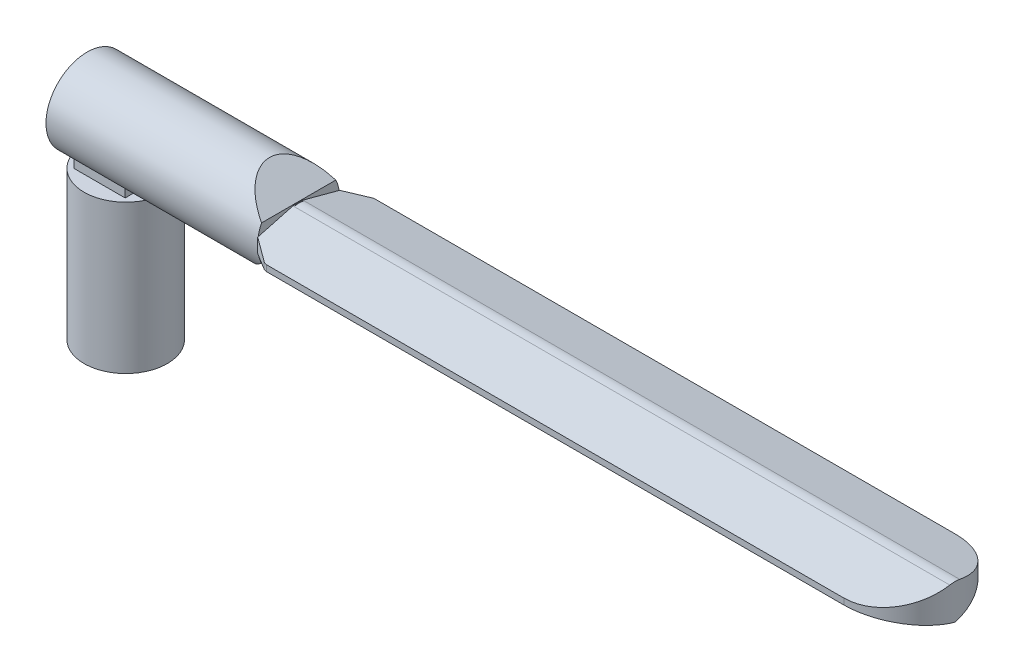
ISO-10303-21;
HEADER;
FILE_DESCRIPTION(('STEP AP214'),'2;1');
FILE_NAME('part.step','',(''),(''),'','','');
FILE_SCHEMA(('AUTOMOTIVE_DESIGN { 1 0 10303 214 1 1 1 1 }'));
ENDSEC;
DATA;
#1=APPLICATION_CONTEXT('core data for automotive mechanical design processes');
#2=APPLICATION_PROTOCOL_DEFINITION('international standard','automotive_design',2000,#1);
#3=PRODUCT_CONTEXT('',#1,'mechanical');
#4=PRODUCT('Part','Part','',(#3));
#5=PRODUCT_RELATED_PRODUCT_CATEGORY('part','',(#4));
#6=PRODUCT_DEFINITION_FORMATION('','',#4);
#7=PRODUCT_DEFINITION_CONTEXT('part definition',#1,'design');
#8=PRODUCT_DEFINITION('design','',#6,#7);
#9=PRODUCT_DEFINITION_SHAPE('','',#8);
#10=(LENGTH_UNIT() NAMED_UNIT(*) SI_UNIT(.MILLI.,.METRE.));
#11=(NAMED_UNIT(*) PLANE_ANGLE_UNIT() SI_UNIT($,.RADIAN.));
#12=(NAMED_UNIT(*) SI_UNIT($,.STERADIAN.) SOLID_ANGLE_UNIT());
#13=UNCERTAINTY_MEASURE_WITH_UNIT(LENGTH_MEASURE(1.E-05),#10,'distance_accuracy_value','');
#14=(GEOMETRIC_REPRESENTATION_CONTEXT(3) GLOBAL_UNCERTAINTY_ASSIGNED_CONTEXT((#13)) GLOBAL_UNIT_ASSIGNED_CONTEXT((#10,
#11,#12)) REPRESENTATION_CONTEXT('',''));
#15=CARTESIAN_POINT('',(0.,0.,0.));
#16=DIRECTION('',(0.,0.,1.));
#17=DIRECTION('',(1.,0.,0.));
#18=AXIS2_PLACEMENT_3D('',#15,#16,#17);
#19=CARTESIAN_POINT('',(-117.132239803963,2.8,8.56407466456359));
#20=DIRECTION('',(0.999999971842602,0.,0.000237307383945253));
#21=DIRECTION('',(0.000237307383945253,0.,-0.999999971842602));
#22=AXIS2_PLACEMENT_3D('',#19,#20,#21);
#23=CYLINDRICAL_SURFACE('',#22,6.42);
#24=CARTESIAN_POINT('',(-55.7280068959359,2.8,8.57864634284846));
#25=DIRECTION('',(0.627517438225577,-0.778602507524096,0.));
#26=DIRECTION('',(0.778602471360075,0.627517409079057,0.000304786302781807));
#27=AXIS2_PLACEMENT_3D('',#24,#25,#26);
#28=ELLIPSE('',#27,10.2307916715817,6.42);
#29=CARTESIAN_POINT('',(-59.1336186924822,0.0552351559265948,14.381515263114));
#30=VERTEX_POINT('',#29);
#31=CARTESIAN_POINT('',(-59.1308639326483,0.0574553643348558,2.77311222677423));
#32=VERTEX_POINT('',#31);
#33=EDGE_CURVE('E315',#30,#32,#28,.T.);
#34=ORIENTED_EDGE('',*,*,#33,.F.);
#35=CARTESIAN_POINT('',(-59.1322414370918,2.8,8.57783849283242));
#36=DIRECTION('',(-0.999999971842602,0.,-0.000237307383945253));
#37=DIRECTION('',(-0.000237307383945253,0.,0.999999971842602));
#38=AXIS2_PLACEMENT_3D('',#35,#36,#37);
#39=CIRCLE('',#38,6.42);
#40=CARTESIAN_POINT('',(-59.1337408927519,1.66359520688498,14.8964603281552));
#41=VERTEX_POINT('',#40);
#42=EDGE_CURVE('E510',#30,#41,#39,.T.);
#43=ORIENTED_EDGE('',*,*,#42,.T.);
#44=CARTESIAN_POINT('',(-59.1337602043918,2.29364272164236,14.9778384928324));
#45=VERTEX_POINT('',#44);
#46=EDGE_CURVE('E508',#41,#45,#39,.T.);
#47=ORIENTED_EDGE('',*,*,#46,.T.);
#48=CARTESIAN_POINT('',(-59.1337602043918,3.30635727835764,14.9778384928324));
#49=VERTEX_POINT('',#48);
#50=EDGE_CURVE('E325',#45,#49,#39,.T.);
#51=ORIENTED_EDGE('',*,*,#50,.T.);
#52=CARTESIAN_POINT('',(-59.1337408927519,3.93640479311502,14.8964603281552));
#53=VERTEX_POINT('',#52);
#54=EDGE_CURVE('E326',#49,#53,#39,.T.);
#55=ORIENTED_EDGE('',*,*,#54,.T.);
#56=CARTESIAN_POINT('',(-59.1336186924822,5.54476484407341,14.381515263114));
#57=VERTEX_POINT('',#56);
#58=EDGE_CURVE('E330',#53,#57,#39,.T.);
#59=ORIENTED_EDGE('',*,*,#58,.T.);
#60=CARTESIAN_POINT('',(-55.7280068959359,2.8,8.57864634284846));
#61=DIRECTION('',(0.627517438225577,0.778602507524095,0.));
#62=DIRECTION('',(0.778602471360075,-0.627517409079057,0.000304786302781807));
#63=AXIS2_PLACEMENT_3D('',#60,#61,#62);
#64=ELLIPSE('',#63,10.2307916715817,6.42);
#65=CARTESIAN_POINT('',(-59.1308639326483,5.54254463566515,2.77311222677423));
#66=VERTEX_POINT('',#65);
#67=EDGE_CURVE('E312',#66,#57,#64,.T.);
#68=ORIENTED_EDGE('',*,*,#67,.F.);
#69=CARTESIAN_POINT('',(-59.1307393914569,3.87395239703215,2.2483026494417));
#70=VERTEX_POINT('',#69);
#71=EDGE_CURVE('E331',#66,#70,#39,.T.);
#72=ORIENTED_EDGE('',*,*,#71,.T.);
#73=CARTESIAN_POINT('',(-59.1324678748693,3.87395228188942,2.24830221972318));
#74=CARTESIAN_POINT('',(-59.13214287009,3.87395230353957,2.24830230052267));
#75=CARTESIAN_POINT('',(-59.1318178653106,3.87395232518973,2.24830238132215));
#76=CARTESIAN_POINT('',(-59.1311678557519,3.87395236849005,2.24830254292113));
#77=CARTESIAN_POINT('',(-59.1308428509726,3.8739523901402,2.24830262372061));
#78=CARTESIAN_POINT('',(-59.1305178461932,3.87395241179036,2.2483027045201));
#79=B_SPLINE_CURVE_WITH_KNOTS('',3,(#73,#74,#75,#76,#77,#78),.UNSPECIFIED.,.F.,.F.,(4,2,4),(0.,
0.000975014370332675,0.00195002874066535),.UNSPECIFIED.);
#80=CARTESIAN_POINT('',(-59.1322414370918,3.87395229697354,2.24830227601791));
#81=VERTEX_POINT('',#80);
#82=EDGE_CURVE('E344',#81,#70,#79,.T.);
#83=ORIENTED_EDGE('',*,*,#82,.F.);
#84=CARTESIAN_POINT('',(-59.1322414370918,2.8,8.57783849283242));
#85=DIRECTION('',(-1.,0.,0.));
#86=DIRECTION('',(0.,0.,1.));
#87=AXIS2_PLACEMENT_3D('',#84,#85,#86);
#88=ELLIPSE('',#87,6.4200001807705,6.42);
#89=CARTESIAN_POINT('',(-59.1322414370918,3.24527621659354,2.17329858735413));
#90=VERTEX_POINT('',#89);
#91=EDGE_CURVE('E342',#90,#81,#88,.F.);
#92=ORIENTED_EDGE('',*,*,#91,.F.);
#93=CARTESIAN_POINT('',(-68.4825954280634,2.8,8.57561958472538));
#94=DIRECTION('',(0.564967003424933,0.,0.825113498278299));
#95=DIRECTION('',(0.825113498278299,0.,-0.564967003424933));
#96=AXIS2_PLACEMENT_3D('',#93,#94,#95);
#97=ELLIPSE('',#96,11.359558836909,6.42);
#98=CARTESIAN_POINT('',(-59.1307213454424,3.23003854493289,2.17225775887914));
#99=VERTEX_POINT('',#98);
#100=EDGE_CURVE('E345',#90,#99,#97,.F.);
#101=ORIENTED_EDGE('',*,*,#100,.T.);
#102=CARTESIAN_POINT('',(-59.1307213454424,2.36996145506712,2.17225775887914));
#103=VERTEX_POINT('',#102);
#104=EDGE_CURVE('E504',#99,#103,#39,.T.);
#105=ORIENTED_EDGE('',*,*,#104,.T.);
#106=CARTESIAN_POINT('',(-59.1322414370918,2.35472378340646,2.17329858735413));
#107=VERTEX_POINT('',#106);
#108=EDGE_CURVE('E341',#103,#107,#97,.F.);
#109=ORIENTED_EDGE('',*,*,#108,.T.);
#110=CARTESIAN_POINT('',(-59.1322414370918,1.72604770302646,2.24830227601791));
#111=VERTEX_POINT('',#110);
#112=EDGE_CURVE('E338',#111,#107,#88,.F.);
#113=ORIENTED_EDGE('',*,*,#112,.F.);
#114=CARTESIAN_POINT('',(-59.1305178461932,1.72604758820964,2.2483027045201));
#115=CARTESIAN_POINT('',(-59.1308428509726,1.7260476098598,2.24830262372061));
#116=CARTESIAN_POINT('',(-59.1311678557519,1.72604763150995,2.24830254292113));
#117=CARTESIAN_POINT('',(-59.1318178653106,1.72604767481027,2.24830238132215));
#118=CARTESIAN_POINT('',(-59.13214287009,1.72604769646043,2.24830230052267));
#119=CARTESIAN_POINT('',(-59.1324678748693,1.72604771811058,2.24830221972318));
#120=B_SPLINE_CURVE_WITH_KNOTS('',3,(#114,#115,#116,#117,#118,#119),.UNSPECIFIED.,.F.,.F.,(4,2,
4),(0.,0.000975014370332675,0.00195002874066535),.UNSPECIFIED.);
#121=CARTESIAN_POINT('',(-59.1307393914569,1.72604760296785,2.2483026494417));
#122=VERTEX_POINT('',#121);
#123=EDGE_CURVE('E372',#122,#111,#120,.T.);
#124=ORIENTED_EDGE('',*,*,#123,.F.);
#125=EDGE_CURVE('E511',#122,#32,#39,.T.);
#126=ORIENTED_EDGE('',*,*,#125,.T.);
#127=EDGE_LOOP('',(#34,#43,#47,#51,#55,#59,#68,#72,#83,#92,#101,#105,#109,#113,#124,#126));
#128=FACE_BOUND('',#127,.T.);
#129=DIRECTION('',(0.999999971842602,0.,0.000237307383945253));
#130=VECTOR('',#129,1.);
#131=CARTESIAN_POINT('',(-117.131946616476,-3.5,7.32859908243293));
#132=LINE('',#131,#130);
#133=CARTESIAN_POINT('',(-82.2112775705985,-3.5,7.33688601528316));
#134=VERTEX_POINT('',#133);
#135=CARTESIAN_POINT('',(-79.8051263130756,-3.5,7.33745701275954));
#136=VERTEX_POINT('',#135);
#137=EDGE_CURVE('E276',#134,#136,#132,.T.);
#138=ORIENTED_EDGE('',*,*,#137,.F.);
#139=CARTESIAN_POINT('',(-82.2112775705985,2.8,8.57236166698938));
#140=DIRECTION('',(-1.,0.,0.));
#141=DIRECTION('',(0.,0.,1.));
#142=AXIS2_PLACEMENT_3D('',#139,#140,#141);
#143=ELLIPSE('',#142,6.4200001807705,6.42);
#144=CARTESIAN_POINT('',(-82.2112775705985,-2.17942500643053,4.51998859308311));
#145=VERTEX_POINT('',#144);
#146=EDGE_CURVE('E286',#145,#134,#143,.T.);
#147=ORIENTED_EDGE('',*,*,#146,.F.);
#148=CARTESIAN_POINT('',(-17158.6835408057,2.8,4.51998859308311));
#149=DIRECTION('',(0.,0.,-1.));
#150=DIRECTION('',(1.,0.,0.));
#151=AXIS2_PLACEMENT_3D('',#148,#149,#150);
#152=ELLIPSE('',#151,27053.5197568109,6.42);
#153=CARTESIAN_POINT('',(-90.2112775705985,-2.18096941557892,4.51998859308311));
#154=VERTEX_POINT('',#153);
#155=EDGE_CURVE('E301',#145,#154,#152,.T.);
#156=ORIENTED_EDGE('',*,*,#155,.T.);
#157=CARTESIAN_POINT('',(-92.2112775705985,-2.1813553299984,4.51998859308311));
#158=VERTEX_POINT('',#157);
#159=EDGE_CURVE('E300',#154,#158,#152,.T.);
#160=ORIENTED_EDGE('',*,*,#159,.T.);
#161=CARTESIAN_POINT('',(-92.2112775705985,2.8,8.56998859308311));
#162=DIRECTION('',(1.,0.,0.));
#163=DIRECTION('',(0.,0.,1.));
#164=AXIS2_PLACEMENT_3D('',#161,#162,#163);
#165=ELLIPSE('',#164,6.4200001807705,6.42);
#166=CARTESIAN_POINT('',(-92.2112775705985,-2.1813553299984,12.6199885930831));
#167=VERTEX_POINT('',#166);
#168=EDGE_CURVE('E552',#158,#167,#165,.T.);
#169=ORIENTED_EDGE('',*,*,#168,.T.);
#170=CARTESIAN_POINT('',(16974.2609856645,2.8,12.6199885930831));
#171=DIRECTION('',(0.,0.,1.));
#172=DIRECTION('',(1.,0.,0.));
#173=AXIS2_PLACEMENT_3D('',#170,#171,#172);
#174=ELLIPSE('',#173,27053.5197568109,6.42);
#175=CARTESIAN_POINT('',(-90.2112775705985,-2.18174116930576,12.6199885930831));
#176=VERTEX_POINT('',#175);
#177=EDGE_CURVE('E297',#167,#176,#174,.T.);
#178=ORIENTED_EDGE('',*,*,#177,.T.);
#179=CARTESIAN_POINT('',(16974.2609856645,2.8,12.6199885930831));
#180=DIRECTION('',(0.,0.,-1.));
#181=DIRECTION('',(1.,0.,0.));
#182=AXIS2_PLACEMENT_3D('',#179,#180,#181);
#183=ELLIPSE('',#182,27053.5197568109,6.42);
#184=CARTESIAN_POINT('',(-82.2112775705985,-2.18328377576296,12.6199885930831));
#185=VERTEX_POINT('',#184);
#186=EDGE_CURVE('E283',#185,#176,#183,.T.);
#187=ORIENTED_EDGE('',*,*,#186,.F.);
#188=CARTESIAN_POINT('',(-82.2112775705985,2.8,8.57236166698938));
#189=DIRECTION('',(1.,0.,0.));
#190=DIRECTION('',(0.,0.,1.));
#191=AXIS2_PLACEMENT_3D('',#188,#189,#190);
#192=ELLIPSE('',#191,6.4200001807705,6.42);
#193=CARTESIAN_POINT('',(-82.2112775705985,-3.5,9.8078373186956));
#194=VERTEX_POINT('',#193);
#195=EDGE_CURVE('E56',#185,#194,#192,.T.);
#196=ORIENTED_EDGE('',*,*,#195,.T.);
#197=DIRECTION('',(0.999999971842602,0.,0.000237307383945253));
#198=VECTOR('',#197,1.);
#199=CARTESIAN_POINT('',(-117.132532991449,-3.5,9.79955024669426));
#200=LINE('',#199,#198);
#201=CARTESIAN_POINT('',(-79.8137043993653,-3.5,9.80840628052871));
#202=VERTEX_POINT('',#201);
#203=EDGE_CURVE('E66',#202,#194,#200,.F.);
#204=ORIENTED_EDGE('',*,*,#203,.F.);
#205=CARTESIAN_POINT('',(-79.8051263130756,-3.5,7.33745701275954));
#206=CARTESIAN_POINT('',(-79.7808758210322,-3.52502745063651,7.46495715602008));
#207=CARTESIAN_POINT('',(-79.7603517297202,-3.54627508851655,7.59392788161567));
#208=CARTESIAN_POINT('',(-79.7270160982325,-3.58095356912876,7.85395282916409));
#209=CARTESIAN_POINT('',(-79.714207724009,-3.59438120304222,7.98500788376156));
#210=CARTESIAN_POINT('',(-79.6967814143643,-3.61293098181828,8.24528329448746));
#211=CARTESIAN_POINT('',(-79.6919860755376,-3.61823280066718,8.37447879629126));
#212=CARTESIAN_POINT('',(-79.6901151149424,-3.62102020325441,8.63294048347601));
#213=CARTESIAN_POINT('',(-79.6930360532204,-3.6185092698668,8.7622066116833));
#214=CARTESIAN_POINT('',(-79.7078706289322,-3.60447032890725,9.04508359766209));
#215=CARTESIAN_POINT('',(-79.7214240721797,-3.59128223529515,9.1985352852453));
#216=CARTESIAN_POINT('',(-79.7498378416698,-3.56331770183063,9.42771932825835));
#217=CARTESIAN_POINT('',(-79.7607603092227,-3.55252908732739,9.50447397158576));
#218=CARTESIAN_POINT('',(-79.7852593497036,-3.52826332123425,9.65712089561353));
#219=CARTESIAN_POINT('',(-79.7988356065545,-3.51478648981827,9.73301327787483));
#220=CARTESIAN_POINT('',(-79.8137043993653,-3.50000000000001,9.80840628052871));
#221=B_SPLINE_CURVE_WITH_KNOTS('',3,(#205,#206,#207,#208,#209,#210,#211,#212,#213,#214,#215,
#216,#217,#218,#219,#220),.UNSPECIFIED.,.F.,.F.,(4,2,2,2,2,2,2,4),(0.,0.396446534136642,
0.793055629618339,1.18076170985585,1.56829497801496,2.03126392781121,2.26600766161225,
2.50072345347582),.UNSPECIFIED.);
#222=EDGE_CURVE('E11',#136,#202,#221,.T.);
#223=ORIENTED_EDGE('',*,*,#222,.F.);
#224=EDGE_LOOP('',(#138,#147,#156,#160,#169,#178,#187,#196,#204,#223));
#225=FACE_BOUND('',#224,.T.);
#226=ADVANCED_FACE('F41',(#128,#225),#23,.T.);
#227=CARTESIAN_POINT('',(-92.2112775705985,-16.,4.51998859308311));
#228=DIRECTION('',(0.,0.,-1.));
#229=DIRECTION('',(-1.,0.,0.));
#230=AXIS2_PLACEMENT_3D('',#227,#228,#229);
#231=PLANE('',#230);
#232=DIRECTION('',(0.,1.,0.));
#233=VECTOR('',#232,1.);
#234=CARTESIAN_POINT('',(-90.2112775705985,-3.5,4.51998859308311));
#235=LINE('',#234,#233);
#236=CARTESIAN_POINT('',(-90.2112775705985,0.,4.51998859308311));
#237=VERTEX_POINT('',#236);
#238=EDGE_CURVE('E262',#154,#237,#235,.T.);
#239=ORIENTED_EDGE('',*,*,#238,.T.);
#240=DIRECTION('',(-1.,0.,0.));
#241=VECTOR('',#240,1.);
#242=CARTESIAN_POINT('',(-92.2112775705985,0.,4.51998859308311));
#243=LINE('',#242,#241);
#244=CARTESIAN_POINT('',(-92.2112775705985,0.,4.51998859308311));
#245=VERTEX_POINT('',#244);
#246=EDGE_CURVE('E292',#237,#245,#243,.T.);
#247=ORIENTED_EDGE('',*,*,#246,.T.);
#248=DIRECTION('',(0.,1.,0.));
#249=VECTOR('',#248,1.);
#250=CARTESIAN_POINT('',(-92.2112775705985,-3.62,4.51998859308311));
#251=LINE('',#250,#249);
#252=EDGE_CURVE('E563',#158,#245,#251,.T.);
#253=ORIENTED_EDGE('',*,*,#252,.F.);
#254=ORIENTED_EDGE('',*,*,#159,.F.);
#255=EDGE_LOOP('',(#239,#247,#253,#254));
#256=FACE_BOUND('',#255,.T.);
#257=ADVANCED_FACE('F363',(#256),#231,.F.);
#258=CARTESIAN_POINT('',(-92.2112775705985,-16.,12.6199885930831));
#259=DIRECTION('',(0.,0.,1.));
#260=DIRECTION('',(1.,0.,0.));
#261=AXIS2_PLACEMENT_3D('',#258,#259,#260);
#262=PLANE('',#261);
#263=DIRECTION('',(0.,1.,0.));
#264=VECTOR('',#263,1.);
#265=CARTESIAN_POINT('',(-90.2112775705985,-3.5,12.6199885930831));
#266=LINE('',#265,#264);
#267=CARTESIAN_POINT('',(-90.2112775705985,0.,12.6199885930831));
#268=VERTEX_POINT('',#267);
#269=EDGE_CURVE('E263',#176,#268,#266,.T.);
#270=ORIENTED_EDGE('',*,*,#269,.F.);
#271=ORIENTED_EDGE('',*,*,#177,.F.);
#272=DIRECTION('',(0.,-1.,0.));
#273=VECTOR('',#272,1.);
#274=CARTESIAN_POINT('',(-92.2112775705985,-3.62,12.6199885930831));
#275=LINE('',#274,#273);
#276=CARTESIAN_POINT('',(-92.2112775705985,0.,12.6199885930831));
#277=VERTEX_POINT('',#276);
#278=EDGE_CURVE('E560',#277,#167,#275,.T.);
#279=ORIENTED_EDGE('',*,*,#278,.F.);
#280=DIRECTION('',(1.,0.,0.));
#281=VECTOR('',#280,1.);
#282=CARTESIAN_POINT('',(-92.2112775705985,0.,12.6199885930831));
#283=LINE('',#282,#281);
#284=EDGE_CURVE('E289',#277,#268,#283,.T.);
#285=ORIENTED_EDGE('',*,*,#284,.T.);
#286=EDGE_LOOP('',(#270,#271,#279,#285));
#287=FACE_BOUND('',#286,.T.);
#288=ADVANCED_FACE('F589',(#287),#262,.F.);
#289=CARTESIAN_POINT('',(0.,0.,0.));
#290=DIRECTION('',(0.,1.,0.));
#291=DIRECTION('',(0.,0.,1.));
#292=AXIS2_PLACEMENT_3D('',#289,#290,#291);
#293=PLANE('',#292);
#294=DIRECTION('',(0.,0.,-1.));
#295=VECTOR('',#294,1.);
#296=CARTESIAN_POINT('',(-90.2112775705985,0.,4.51998859308311));
#297=LINE('',#296,#295);
#298=EDGE_CURVE('E273',#268,#237,#297,.T.);
#299=ORIENTED_EDGE('',*,*,#298,.F.);
#300=ORIENTED_EDGE('',*,*,#284,.F.);
#301=DIRECTION('',(0.,0.,1.));
#302=VECTOR('',#301,1.);
#303=CARTESIAN_POINT('',(-92.2112775705985,0.,8.56998859308311));
#304=LINE('',#303,#302);
#305=EDGE_CURVE('E294',#245,#277,#304,.T.);
#306=ORIENTED_EDGE('',*,*,#305,.F.);
#307=ORIENTED_EDGE('',*,*,#246,.F.);
#308=EDGE_LOOP('',(#299,#300,#306,#307));
#309=FACE_BOUND('',#308,.T.);
#310=ADVANCED_FACE('F389',(#309),#293,.F.);
#311=CARTESIAN_POINT('',(34.8662397956082,0.,8.69000000000002));
#312=DIRECTION('',(0.,0.965925826289066,0.258819045102528));
#313=DIRECTION('',(1.,0.,0.));
#314=AXIS2_PLACEMENT_3D('',#311,#312,#313);
#315=PLANE('',#314);
#316=DIRECTION('',(1.,0.,0.));
#317=VECTOR('',#316,1.);
#318=CARTESIAN_POINT('',(34.8662397956082,0.000289587050011607,8.68891924641616));
#319=LINE('',#318,#317);
#320=CARTESIAN_POINT('',(-58.9436505515468,0.000289587050009449,8.68891924641616));
#321=VERTEX_POINT('',#320);
#322=CARTESIAN_POINT('',(43.5551590420244,0.000289587050012603,8.68891924641616));
#323=VERTEX_POINT('',#322);
#324=EDGE_CURVE('E435',#321,#323,#319,.T.);
#325=ORIENTED_EDGE('',*,*,#324,.F.);
#326=DIRECTION('',(0.,-0.258819045102528,0.965925826289066));
#327=VECTOR('',#326,1.);
#328=CARTESIAN_POINT('',(-58.9436505515468,0.,8.69000000000002));
#329=LINE('',#328,#327);
#330=CARTESIAN_POINT('',(-58.9436505515468,0.208340649413047,7.91246211110868));
#331=VERTEX_POINT('',#330);
#332=EDGE_CURVE('E322',#321,#331,#329,.F.);
#333=ORIENTED_EDGE('',*,*,#332,.T.);
#334=DIRECTION('',(0.305754930362129,0.246424264976754,-0.919667877111034));
#335=VECTOR('',#334,1.);
#336=CARTESIAN_POINT('',(-50.4080675965343,7.08762384967373,-17.7613723119185));
#337=LINE('',#336,#335);
#338=CARTESIAN_POINT('',(-59.1322181355043,0.0563639397648368,8.47964691308289));
#339=VERTEX_POINT('',#338);
#340=EDGE_CURVE('E317',#331,#339,#337,.F.);
#341=ORIENTED_EDGE('',*,*,#340,.T.);
#342=DIRECTION('',(0.00022922133135417,0.258819038303038,-0.965925800913027));
#343=VECTOR('',#342,1.);
#344=CARTESIAN_POINT('',(-59.1333280189343,-1.19683077944475,13.15663327695));
#345=LINE('',#344,#343);
#346=EDGE_CURVE('E421',#122,#339,#345,.F.);
#347=ORIENTED_EDGE('',*,*,#346,.F.);
#348=ORIENTED_EDGE('',*,*,#123,.T.);
#349=DIRECTION('',(0.,0.258819045102528,-0.965925826289066));
#350=VECTOR('',#349,1.);
#351=CARTESIAN_POINT('',(-59.1322414370918,0.403169246195493,7.18535188914924));
#352=LINE('',#351,#350);
#353=CARTESIAN_POINT('',(-59.1322414370918,1.74614488083327,2.17329858735413));
#354=VERTEX_POINT('',#353);
#355=EDGE_CURVE('E424',#354,#111,#352,.F.);
#356=ORIENTED_EDGE('',*,*,#355,.F.);
#357=DIRECTION('',(0.815818536320453,0.149677118278064,-0.558602610144214));
#358=VECTOR('',#357,1.);
#359=CARTESIAN_POINT('',(0.246375695347363,12.6402590790781,-38.4840891039518));
#360=LINE('',#359,#358);
#361=CARTESIAN_POINT('',(-55.958218902423,2.32847848222653,0.));
#362=VERTEX_POINT('',#361);
#363=EDGE_CURVE('E427',#362,#354,#360,.F.);
#364=ORIENTED_EDGE('',*,*,#363,.F.);
#365=DIRECTION('',(-1.,0.,0.));
#366=VECTOR('',#365,1.);
#367=CARTESIAN_POINT('',(-55.958218902423,2.32847848222653,0.));
#368=LINE('',#367,#366);
#369=CARTESIAN_POINT('',(34.8662397956082,2.32847848222653,0.));
#370=VERTEX_POINT('',#369);
#371=EDGE_CURVE('E430',#370,#362,#368,.T.);
#372=ORIENTED_EDGE('',*,*,#371,.F.);
#373=CARTESIAN_POINT('',(34.8662397956082,0.000289587049998562,8.68891924641621));
#374=DIRECTION('',(0.,0.965925826289066,0.258819045102528));
#375=DIRECTION('',(0.,-0.258819045102528,0.965925826289066));
#376=AXIS2_PLACEMENT_3D('',#373,#374,#375);
#377=ELLIPSE('',#376,8.99543112932145,8.68891924641621);
#378=EDGE_CURVE('E433',#323,#370,#377,.T.);
#379=ORIENTED_EDGE('',*,*,#378,.F.);
#380=EDGE_LOOP('',(#325,#333,#341,#347,#348,#356,#364,#372,#379));
#381=FACE_BOUND('',#380,.T.);
#382=ADVANCED_FACE('F385',(#381),#315,.F.);
#383=CARTESIAN_POINT('',(34.8662397956082,0.,8.6878384928323));
#384=DIRECTION('',(0.,0.965925826289069,-0.258819045102518));
#385=DIRECTION('',(-1.,0.,0.));
#386=AXIS2_PLACEMENT_3D('',#383,#384,#385);
#387=PLANE('',#386);
#388=DIRECTION('',(-0.305754930362118,-0.246424264976745,-0.91966787711104));
#389=VECTOR('',#388,1.);
#390=CARTESIAN_POINT('',(-50.4080675965349,7.08762384967324,35.1392108047501));
#391=LINE('',#390,#389);
#392=CARTESIAN_POINT('',(-59.1323173884015,0.0562839465420773,8.89789304097782));
#393=VERTEX_POINT('',#392);
#394=CARTESIAN_POINT('',(-58.9436505515468,0.208340649413051,9.46537638172371));
#395=VERTEX_POINT('',#394);
#396=EDGE_CURVE('E314',#393,#395,#391,.F.);
#397=ORIENTED_EDGE('',*,*,#396,.T.);
#398=DIRECTION('',(0.,0.258819045102518,0.965925826289069));
#399=VECTOR('',#398,1.);
#400=CARTESIAN_POINT('',(-58.9436505515468,0.,8.6878384928323));
#401=LINE('',#400,#399);
#402=EDGE_CURVE('E548',#395,#321,#401,.F.);
#403=ORIENTED_EDGE('',*,*,#402,.T.);
#404=ORIENTED_EDGE('',*,*,#324,.T.);
#405=CARTESIAN_POINT('',(34.8662397956082,0.000289587050024583,8.68891924641621));
#406=DIRECTION('',(0.,0.965925826289069,-0.258819045102518));
#407=DIRECTION('',(0.,-0.258819045102518,-0.965925826289069));
#408=AXIS2_PLACEMENT_3D('',#405,#406,#407);
#409=ELLIPSE('',#408,8.99543112932142,8.68891924641621);
#410=CARTESIAN_POINT('',(34.8662397956082,2.32847848222646,17.3778384928324));
#411=VERTEX_POINT('',#410);
#412=EDGE_CURVE('E450',#411,#323,#409,.T.);
#413=ORIENTED_EDGE('',*,*,#412,.F.);
#414=DIRECTION('',(1.,0.,0.));
#415=VECTOR('',#414,1.);
#416=CARTESIAN_POINT('',(34.8662397956082,2.32847848222646,17.3778384928324));
#417=LINE('',#416,#415);
#418=CARTESIAN_POINT('',(-55.3238356065649,2.32847848222646,17.3778384928324));
#419=VERTEX_POINT('',#418);
#420=EDGE_CURVE('E453',#419,#411,#417,.T.);
#421=ORIENTED_EDGE('',*,*,#420,.F.);
#422=CARTESIAN_POINT('',(-55.3238356065649,2.06052928979534,16.3778384928324));
#423=DIRECTION('',(0.,0.965925826289069,-0.258819045102518));
#424=DIRECTION('',(0.,-0.258819045102518,-0.965925826289069));
#425=AXIS2_PLACEMENT_3D('',#422,#423,#424);
#426=ELLIPSE('',#425,1.03527618041008,1.);
#427=CARTESIAN_POINT('',(-55.8893639621164,2.28151471962211,17.2025673446784));
#428=VERTEX_POINT('',#427);
#429=EDGE_CURVE('E415',#419,#428,#426,.F.);
#430=ORIENTED_EDGE('',*,*,#429,.T.);
#431=DIRECTION('',(-0.815420062977005,-0.149822501051534,-0.559145186041372));
#432=VECTOR('',#431,1.);
#433=CARTESIAN_POINT('',(-55.2340840696887,2.40191361195973,17.6519021280574));
#434=LINE('',#433,#432);
#435=CARTESIAN_POINT('',(-59.1337602043918,1.68540042039177,14.9778384928324));
#436=VERTEX_POINT('',#435);
#437=EDGE_CURVE('E455',#436,#428,#434,.F.);
#438=ORIENTED_EDGE('',*,*,#437,.F.);
#439=DIRECTION('',(0.00022922133135417,-0.258819038303028,-0.965925800913029));
#440=VECTOR('',#439,1.);
#441=CARTESIAN_POINT('',(-59.1339924452325,1.94762885562546,15.9564883363138));
#442=LINE('',#441,#440);
#443=EDGE_CURVE('E460',#41,#436,#442,.F.);
#444=ORIENTED_EDGE('',*,*,#443,.F.);
#445=EDGE_CURVE('E457',#393,#41,#442,.F.);
#446=ORIENTED_EDGE('',*,*,#445,.F.);
#447=EDGE_LOOP('',(#397,#403,#404,#413,#421,#430,#438,#444,#446));
#448=FACE_BOUND('',#447,.T.);
#449=ADVANCED_FACE('F388',(#448),#387,.F.);
#450=CARTESIAN_POINT('',(-59.1322414370918,2.8,8.57783849283242));
#451=DIRECTION('',(-0.999999971842602,0.,-0.000237307383945253));
#452=DIRECTION('',(-0.000237307383945253,0.,0.999999971842602));
#453=AXIS2_PLACEMENT_3D('',#450,#451,#452);
#454=PLANE('',#453);
#455=DIRECTION('',(0.000237307379604913,-0.000191258719927884,-0.999999953552654));
#456=VECTOR('',#455,1.);
#457=CARTESIAN_POINT('',(-59.1322413125653,5.54365473986928,8.57731374494412));
#458=LINE('',#457,#456);
#459=EDGE_CURVE('E308',#57,#66,#458,.T.);
#460=ORIENTED_EDGE('',*,*,#459,.F.);
#461=ORIENTED_EDGE('',*,*,#58,.F.);
#462=DIRECTION('',(-0.00022922133135417,-0.258819038303028,0.965925800913029));
#463=VECTOR('',#462,1.);
#464=CARTESIAN_POINT('',(-59.1343248031121,3.27709827494915,17.3570257517116));
#465=LINE('',#464,#463);
#466=CARTESIAN_POINT('',(-59.1324520563923,5.39165935058695,9.46537638172373));
#467=VERTEX_POINT('',#466);
#468=EDGE_CURVE('E329',#467,#53,#465,.T.);
#469=ORIENTED_EDGE('',*,*,#468,.F.);
#470=CARTESIAN_POINT('',(-59.1322677973756,2.49388187171974,8.68891924641618));
#471=DIRECTION('',(-0.999999971842602,0.,-0.000237307383945253));
#472=DIRECTION('',(-0.000237307383945253,0.,0.999999971842602));
#473=AXIS2_PLACEMENT_3D('',#470,#471,#472);
#474=ELLIPSE('',#473,3.0000000844722,3.);
#475=CARTESIAN_POINT('',(-59.1320835383589,5.39165935058694,7.9124621111086));
#476=VERTEX_POINT('',#475);
#477=EDGE_CURVE('E628',#467,#476,#474,.T.);
#478=ORIENTED_EDGE('',*,*,#477,.T.);
#479=DIRECTION('',(0.00022922133135417,-0.258819038303038,-0.965925800913027));
#480=VECTOR('',#479,1.);
#481=CARTESIAN_POINT('',(-59.1336602492637,7.17195962913816,14.5566332033906));
#482=LINE('',#481,#480);
#483=EDGE_CURVE('E441',#476,#70,#482,.T.);
#484=ORIENTED_EDGE('',*,*,#483,.T.);
#485=ORIENTED_EDGE('',*,*,#71,.F.);
#486=EDGE_LOOP('',(#460,#461,#469,#478,#484,#485));
#487=FACE_BOUND('',#486,.T.);
#488=ADVANCED_FACE('F365',(#487),#454,.F.);
#489=DIRECTION('',(-0.000237307379604913,-0.000191258719927884,0.999999953552654));
#490=VECTOR('',#489,1.);
#491=CARTESIAN_POINT('',(-59.1322413125653,0.0563452601307249,8.57731374494412));
#492=LINE('',#491,#490);
#493=EDGE_CURVE('E546',#32,#339,#492,.T.);
#494=ORIENTED_EDGE('',*,*,#493,.F.);
#495=ORIENTED_EDGE('',*,*,#125,.F.);
#496=ORIENTED_EDGE('',*,*,#346,.T.);
#497=EDGE_LOOP('',(#494,#495,#496));
#498=FACE_BOUND('',#497,.T.);
#499=ADVANCED_FACE('F545',(#498),#454,.F.);
#500=EDGE_CURVE('E549',#393,#30,#492,.T.);
#501=ORIENTED_EDGE('',*,*,#500,.F.);
#502=ORIENTED_EDGE('',*,*,#445,.T.);
#503=ORIENTED_EDGE('',*,*,#42,.F.);
#504=EDGE_LOOP('',(#501,#502,#503));
#505=FACE_BOUND('',#504,.T.);
#506=ADVANCED_FACE('F402',(#505),#454,.F.);
#507=CARTESIAN_POINT('',(34.8662397956082,2.49388187171974,8.68891924641617));
#508=DIRECTION('',(-1.,0.,0.));
#509=DIRECTION('',(0.,0.,1.));
#510=AXIS2_PLACEMENT_3D('',#507,#508,#509);
#511=CYLINDRICAL_SURFACE('',#510,3.);
#512=DIRECTION('',(-1.,0.,0.));
#513=VECTOR('',#512,1.);
#514=CARTESIAN_POINT('',(34.8662397956082,5.39165935058695,9.46537638172373));
#515=LINE('',#514,#513);
#516=CARTESIAN_POINT('',(-58.9436505515468,5.39165935058695,9.46537638172373));
#517=VERTEX_POINT('',#516);
#518=EDGE_CURVE('E380',#517,#467,#515,.T.);
#519=ORIENTED_EDGE('',*,*,#518,.F.);
#520=CARTESIAN_POINT('',(-55.3481858300042,2.49388187171974,8.68891924641618));
#521=DIRECTION('',(0.627517438225577,0.778602507524095,0.));
#522=DIRECTION('',(-0.778602507524095,0.627517438225577,0.));
#523=AXIS2_PLACEMENT_3D('',#520,#521,#522);
#524=ELLIPSE('',#523,4.78074363715383,3.);
#525=CARTESIAN_POINT('',(-58.9436505515468,5.39165935058695,7.91246211110863));
#526=VERTEX_POINT('',#525);
#527=EDGE_CURVE('E554',#517,#526,#524,.F.);
#528=ORIENTED_EDGE('',*,*,#527,.T.);
#529=DIRECTION('',(-1.,0.,0.));
#530=VECTOR('',#529,1.);
#531=CARTESIAN_POINT('',(-55.958218902423,5.39165935058694,7.9124621111086));
#532=LINE('',#531,#530);
#533=EDGE_CURVE('E631',#476,#526,#532,.F.);
#534=ORIENTED_EDGE('',*,*,#533,.F.);
#535=ORIENTED_EDGE('',*,*,#477,.F.);
#536=EDGE_LOOP('',(#519,#528,#534,#535));
#537=FACE_BOUND('',#536,.T.);
#538=ADVANCED_FACE('F43',(#537),#511,.T.);
#539=CARTESIAN_POINT('',(43.5203967151337,5.39165935058694,7.91246211110859));
#540=VERTEX_POINT('',#539);
#541=EDGE_CURVE('E637',#526,#540,#532,.F.);
#542=ORIENTED_EDGE('',*,*,#541,.F.);
#543=CARTESIAN_POINT('',(-58.9436505515468,2.49388187171974,8.68891924641618));
#544=DIRECTION('',(-1.,0.,0.));
#545=DIRECTION('',(0.,0.,1.));
#546=AXIS2_PLACEMENT_3D('',#543,#544,#545);
#547=CIRCLE('',#546,3.);
#548=EDGE_CURVE('E677',#526,#517,#547,.F.);
#549=ORIENTED_EDGE('',*,*,#548,.T.);
#550=CARTESIAN_POINT('',(43.5203967151337,5.39165935058695,9.46537638172373));
#551=VERTEX_POINT('',#550);
#552=EDGE_CURVE('E383',#551,#517,#515,.T.);
#553=ORIENTED_EDGE('',*,*,#552,.F.);
#554=CARTESIAN_POINT('',(43.5203967151337,5.39165935058694,7.91246211110859));
#555=CARTESIAN_POINT('',(43.5274161954196,5.41260344746621,7.99058563525631));
#556=CARTESIAN_POINT('',(43.5334336082892,5.4303914599033,8.06964927788868));
#557=CARTESIAN_POINT('',(43.5433491024557,5.45953968504035,8.22910629146036));
#558=CARTESIAN_POINT('',(43.5472465807495,5.47089806890734,8.30950003404535));
#559=CARTESIAN_POINT('',(43.5527396517106,5.48687543773905,8.46918347624755));
#560=CARTESIAN_POINT('',(43.5543856182854,5.49164193330061,8.54845665615965));
#561=CARTESIAN_POINT('',(43.5555023257781,5.49487587917558,8.70711320610669));
#562=CARTESIAN_POINT('',(43.5549738674154,5.49334564822244,8.78649652482056));
#563=CARTESIAN_POINT('',(43.5513109575309,5.48272745658037,8.96631680907991));
#564=CARTESIAN_POINT('',(43.5475093013821,5.47170433909288,9.06663130175489));
#565=CARTESIAN_POINT('',(43.5365074108368,5.4394509606525,9.26694570528913));
#566=CARTESIAN_POINT('',(43.5292577383407,5.41807213310539,9.36691901556857));
#567=CARTESIAN_POINT('',(43.5203967151337,5.39165935058695,9.46537638172373));
#568=B_SPLINE_CURVE_WITH_KNOTS('',3,(#554,#555,#556,#557,#558,#559,#560,#561,#562,#563,#564,
#565,#566,#567),.UNSPECIFIED.,.F.,.F.,(4,2,2,2,2,2,4),(0.,0.243492877537123,0.487054979031359,
0.725073383174689,0.963004146249747,1.26539270741895,1.5722540294871),.UNSPECIFIED.);
#569=EDGE_CURVE('E636',#540,#551,#568,.T.);
#570=ORIENTED_EDGE('',*,*,#569,.F.);
#571=EDGE_LOOP('',(#542,#549,#553,#570));
#572=FACE_BOUND('',#571,.T.);
#573=ADVANCED_FACE('F676',(#572),#511,.T.);
#574=CARTESIAN_POINT('',(-59.1337602043918,5.6,14.9778384928324));
#575=DIRECTION('',(-0.999999971842602,0.,-0.000237307383945253));
#576=DIRECTION('',(-0.000237307383945253,0.,0.999999971842602));
#577=AXIS2_PLACEMENT_3D('',#574,#575,#576);
#578=PLANE('',#577);
#579=DIRECTION('',(0.,-1.,0.));
#580=VECTOR('',#579,1.);
#581=CARTESIAN_POINT('',(-59.1337602043918,5.6,14.9778384928324));
#582=LINE('',#581,#580);
#583=EDGE_CURVE('E481',#45,#436,#582,.T.);
#584=ORIENTED_EDGE('',*,*,#583,.F.);
#585=ORIENTED_EDGE('',*,*,#46,.F.);
#586=ORIENTED_EDGE('',*,*,#443,.T.);
#587=EDGE_LOOP('',(#584,#585,#586));
#588=FACE_BOUND('',#587,.T.);
#589=ADVANCED_FACE('F654',(#588),#578,.T.);
#590=CARTESIAN_POINT('',(-55.958218902423,5.6,0.));
#591=DIRECTION('',(0.564967003424933,0.,0.825113498278299));
#592=DIRECTION('',(0.825113498278299,0.,-0.564967003424933));
#593=AXIS2_PLACEMENT_3D('',#590,#591,#592);
#594=PLANE('',#593);
#595=ORIENTED_EDGE('',*,*,#108,.F.);
#596=DIRECTION('',(0.,-1.,0.));
#597=VECTOR('',#596,1.);
#598=CARTESIAN_POINT('',(-59.1307213454424,5.6,2.17225775887914));
#599=LINE('',#598,#597);
#600=EDGE_CURVE('E333',#99,#103,#599,.T.);
#601=ORIENTED_EDGE('',*,*,#600,.F.);
#602=ORIENTED_EDGE('',*,*,#100,.F.);
#603=DIRECTION('',(0.,-1.,0.));
#604=VECTOR('',#603,1.);
#605=CARTESIAN_POINT('',(-59.1322414370918,5.6,2.17329858735413));
#606=LINE('',#605,#604);
#607=CARTESIAN_POINT('',(-59.1322414370918,3.85385511916673,2.17329858735413));
#608=VERTEX_POINT('',#607);
#609=EDGE_CURVE('E470',#608,#90,#606,.T.);
#610=ORIENTED_EDGE('',*,*,#609,.F.);
#611=DIRECTION('',(0.815818536320453,-0.149677118278064,-0.558602610144214));
#612=VECTOR('',#611,1.);
#613=CARTESIAN_POINT('',(-55.958218902423,3.27152151777347,0.));
#614=LINE('',#613,#612);
#615=CARTESIAN_POINT('',(-55.958218902423,3.27152151777347,0.));
#616=VERTEX_POINT('',#615);
#617=EDGE_CURVE('E437',#608,#616,#614,.T.);
#618=ORIENTED_EDGE('',*,*,#617,.T.);
#619=DIRECTION('',(0.,-1.,0.));
#620=VECTOR('',#619,1.);
#621=CARTESIAN_POINT('',(-55.958218902423,5.6,0.));
#622=LINE('',#621,#620);
#623=EDGE_CURVE('E473',#616,#362,#622,.T.);
#624=ORIENTED_EDGE('',*,*,#623,.T.);
#625=ORIENTED_EDGE('',*,*,#363,.T.);
#626=EDGE_CURVE('E474',#107,#354,#606,.T.);
#627=ORIENTED_EDGE('',*,*,#626,.F.);
#628=EDGE_LOOP('',(#595,#601,#602,#610,#618,#624,#625,#627));
#629=FACE_BOUND('',#628,.T.);
#630=ADVANCED_FACE('F521',(#629),#594,.F.);
#631=CARTESIAN_POINT('',(-59.1322414370918,5.6,8.57783849283242));
#632=DIRECTION('',(-1.,0.,0.));
#633=DIRECTION('',(0.,0.,1.));
#634=AXIS2_PLACEMENT_3D('',#631,#632,#633);
#635=PLANE('',#634);
#636=ORIENTED_EDGE('',*,*,#355,.T.);
#637=ORIENTED_EDGE('',*,*,#112,.T.);
#638=ORIENTED_EDGE('',*,*,#626,.T.);
#639=EDGE_LOOP('',(#636,#637,#638));
#640=FACE_BOUND('',#639,.T.);
#641=ADVANCED_FACE('F540',(#640),#635,.T.);
#642=ORIENTED_EDGE('',*,*,#609,.T.);
#643=ORIENTED_EDGE('',*,*,#91,.T.);
#644=DIRECTION('',(0.,-0.258819045102528,-0.965925826289066));
#645=VECTOR('',#644,1.);
#646=CARTESIAN_POINT('',(-59.1322414370918,5.5719596232081,8.58535188914927));
#647=LINE('',#646,#645);
#648=EDGE_CURVE('E439',#81,#608,#647,.T.);
#649=ORIENTED_EDGE('',*,*,#648,.T.);
#650=EDGE_LOOP('',(#642,#643,#649));
#651=FACE_BOUND('',#650,.T.);
#652=ADVANCED_FACE('F527',(#651),#635,.T.);
#653=CARTESIAN_POINT('',(-55.958218902423,3.27152151777347,0.));
#654=DIRECTION('',(0.,0.965925826289066,-0.258819045102528));
#655=DIRECTION('',(-1.,0.,0.));
#656=AXIS2_PLACEMENT_3D('',#653,#654,#655);
#657=PLANE('',#656);
#658=ORIENTED_EDGE('',*,*,#483,.F.);
#659=ORIENTED_EDGE('',*,*,#533,.T.);
#660=ORIENTED_EDGE('',*,*,#541,.T.);
#661=CARTESIAN_POINT('',(34.8662397956082,5.59971041295,8.68891924641621));
#662=DIRECTION('',(0.,0.965925826289066,-0.258819045102528));
#663=DIRECTION('',(0.,-0.258819045102528,-0.965925826289066));
#664=AXIS2_PLACEMENT_3D('',#661,#662,#663);
#665=ELLIPSE('',#664,8.99543112932145,8.68891924641621);
#666=CARTESIAN_POINT('',(34.8662397956082,3.27152151777347,0.));
#667=VERTEX_POINT('',#666);
#668=EDGE_CURVE('E444',#667,#540,#665,.F.);
#669=ORIENTED_EDGE('',*,*,#668,.F.);
#670=DIRECTION('',(1.,0.,0.));
#671=VECTOR('',#670,1.);
#672=CARTESIAN_POINT('',(34.8662397956082,3.27152151777347,0.));
#673=LINE('',#672,#671);
#674=EDGE_CURVE('E447',#616,#667,#673,.T.);
#675=ORIENTED_EDGE('',*,*,#674,.F.);
#676=ORIENTED_EDGE('',*,*,#617,.F.);
#677=ORIENTED_EDGE('',*,*,#648,.F.);
#678=ORIENTED_EDGE('',*,*,#82,.T.);
#679=EDGE_LOOP('',(#658,#659,#660,#669,#675,#676,#677,#678));
#680=FACE_BOUND('',#679,.T.);
#681=ADVANCED_FACE('F355',(#680),#657,.T.);
#682=DIRECTION('',(0.00022922133135417,0.258819038303028,-0.965925800913029));
#683=VECTOR('',#682,1.);
#684=CARTESIAN_POINT('',(-59.1336602149031,4.02749999406793,14.5564884098732));
#685=LINE('',#684,#683);
#686=CARTESIAN_POINT('',(-59.1337602043918,3.91459957960823,14.9778384928324));
#687=VERTEX_POINT('',#686);
#688=EDGE_CURVE('E463',#687,#53,#685,.T.);
#689=ORIENTED_EDGE('',*,*,#688,.T.);
#690=ORIENTED_EDGE('',*,*,#54,.F.);
#691=EDGE_CURVE('E353',#687,#49,#582,.T.);
#692=ORIENTED_EDGE('',*,*,#691,.F.);
#693=EDGE_LOOP('',(#689,#690,#692));
#694=FACE_BOUND('',#693,.T.);
#695=ADVANCED_FACE('F492',(#694),#578,.T.);
#696=CARTESIAN_POINT('',(-55.6337602043918,5.6,17.3778384928324));
#697=DIRECTION('',(-0.565528355551526,0.,0.824728851845979));
#698=DIRECTION('',(0.824728851845979,0.,0.565528355551526));
#699=AXIS2_PLACEMENT_3D('',#696,#697,#698);
#700=PLANE('',#699);
#701=ORIENTED_EDGE('',*,*,#437,.T.);
#702=DIRECTION('',(0.,-1.,0.));
#703=VECTOR('',#702,1.);
#704=CARTESIAN_POINT('',(-55.8893639621164,5.6,17.2025673446784));
#705=LINE('',#704,#703);
#706=CARTESIAN_POINT('',(-55.8893639621164,3.31848528037789,17.2025673446784));
#707=VERTEX_POINT('',#706);
#708=EDGE_CURVE('E409',#428,#707,#705,.F.);
#709=ORIENTED_EDGE('',*,*,#708,.T.);
#710=DIRECTION('',(-0.815420062977005,0.149822501051534,-0.559145186041372));
#711=VECTOR('',#710,1.);
#712=CARTESIAN_POINT('',(-55.9182263998485,3.32378836623976,17.182775958805));
#713=LINE('',#712,#711);
#714=EDGE_CURVE('E466',#707,#687,#713,.T.);
#715=ORIENTED_EDGE('',*,*,#714,.T.);
#716=ORIENTED_EDGE('',*,*,#691,.T.);
#717=DIRECTION('',(0.,-1.,0.));
#718=VECTOR('',#717,1.);
#719=CARTESIAN_POINT('',(-59.1337602043918,5.6,14.9778384928324));
#720=LINE('',#719,#718);
#721=EDGE_CURVE('E335',#49,#45,#720,.T.);
#722=ORIENTED_EDGE('',*,*,#721,.T.);
#723=ORIENTED_EDGE('',*,*,#583,.T.);
#724=EDGE_LOOP('',(#701,#709,#715,#716,#722,#723));
#725=FACE_BOUND('',#724,.T.);
#726=ADVANCED_FACE('F367',(#725),#700,.T.);
#727=CARTESIAN_POINT('',(34.8662397956082,5.6,17.3778384928324));
#728=DIRECTION('',(0.,0.,1.));
#729=DIRECTION('',(1.,0.,0.));
#730=AXIS2_PLACEMENT_3D('',#727,#728,#729);
#731=PLANE('',#730);
#732=DIRECTION('',(-1.,0.,0.));
#733=VECTOR('',#732,1.);
#734=CARTESIAN_POINT('',(-55.6337602043918,3.27152151777354,17.3778384928324));
#735=LINE('',#734,#733);
#736=CARTESIAN_POINT('',(34.8662397956082,3.27152151777354,17.3778384928324));
#737=VERTEX_POINT('',#736);
#738=CARTESIAN_POINT('',(-55.3238356065649,3.27152151777354,17.3778384928324));
#739=VERTEX_POINT('',#738);
#740=EDGE_CURVE('E468',#737,#739,#735,.T.);
#741=ORIENTED_EDGE('',*,*,#740,.T.);
#742=DIRECTION('',(0.,-1.,0.));
#743=VECTOR('',#742,1.);
#744=CARTESIAN_POINT('',(-55.3238356065649,5.6,17.3778384928324));
#745=LINE('',#744,#743);
#746=EDGE_CURVE('E411',#739,#419,#745,.T.);
#747=ORIENTED_EDGE('',*,*,#746,.T.);
#748=ORIENTED_EDGE('',*,*,#420,.T.);
#749=DIRECTION('',(0.,-1.,0.));
#750=VECTOR('',#749,1.);
#751=CARTESIAN_POINT('',(34.8662397956082,5.6,17.3778384928324));
#752=LINE('',#751,#750);
#753=EDGE_CURVE('E479',#737,#411,#752,.T.);
#754=ORIENTED_EDGE('',*,*,#753,.F.);
#755=EDGE_LOOP('',(#741,#747,#748,#754));
#756=FACE_BOUND('',#755,.T.);
#757=ADVANCED_FACE('F649',(#756),#731,.T.);
#758=CARTESIAN_POINT('',(34.8662397956082,5.6,8.68891924641621));
#759=DIRECTION('',(0.,-1.,0.));
#760=DIRECTION('',(0.,0.,-1.));
#761=AXIS2_PLACEMENT_3D('',#758,#759,#760);
#762=CYLINDRICAL_SURFACE('',#761,8.68891924641621);
#763=ORIENTED_EDGE('',*,*,#668,.T.);
#764=ORIENTED_EDGE('',*,*,#569,.T.);
#765=CARTESIAN_POINT('',(34.8662397956082,5.59971041294998,8.68891924641621));
#766=DIRECTION('',(0.,0.965925826289069,0.258819045102518));
#767=DIRECTION('',(0.,-0.258819045102518,0.965925826289069));
#768=AXIS2_PLACEMENT_3D('',#765,#766,#767);
#769=ELLIPSE('',#768,8.99543112932142,8.68891924641621);
#770=EDGE_CURVE('E461',#551,#737,#769,.F.);
#771=ORIENTED_EDGE('',*,*,#770,.T.);
#772=ORIENTED_EDGE('',*,*,#753,.T.);
#773=ORIENTED_EDGE('',*,*,#412,.T.);
#774=ORIENTED_EDGE('',*,*,#378,.T.);
#775=DIRECTION('',(0.,-1.,0.));
#776=VECTOR('',#775,1.);
#777=CARTESIAN_POINT('',(34.8662397956082,5.6,0.));
#778=LINE('',#777,#776);
#779=EDGE_CURVE('E477',#667,#370,#778,.T.);
#780=ORIENTED_EDGE('',*,*,#779,.F.);
#781=EDGE_LOOP('',(#763,#764,#771,#772,#773,#774,#780));
#782=FACE_BOUND('',#781,.T.);
#783=ADVANCED_FACE('F645',(#782),#762,.T.);
#784=CARTESIAN_POINT('',(-55.958218902423,5.6,0.));
#785=DIRECTION('',(0.,0.,-1.));
#786=DIRECTION('',(-1.,0.,0.));
#787=AXIS2_PLACEMENT_3D('',#784,#785,#786);
#788=PLANE('',#787);
#789=ORIENTED_EDGE('',*,*,#779,.T.);
#790=ORIENTED_EDGE('',*,*,#371,.T.);
#791=ORIENTED_EDGE('',*,*,#623,.F.);
#792=ORIENTED_EDGE('',*,*,#674,.T.);
#793=EDGE_LOOP('',(#789,#790,#791,#792));
#794=FACE_BOUND('',#793,.T.);
#795=ADVANCED_FACE('F403',(#794),#788,.T.);
#796=CARTESIAN_POINT('',(34.8662397956082,3.27152151777354,17.3778384928324));
#797=DIRECTION('',(0.,0.965925826289069,0.258819045102518));
#798=DIRECTION('',(1.,0.,0.));
#799=AXIS2_PLACEMENT_3D('',#796,#797,#798);
#800=PLANE('',#799);
#801=ORIENTED_EDGE('',*,*,#770,.F.);
#802=ORIENTED_EDGE('',*,*,#552,.T.);
#803=ORIENTED_EDGE('',*,*,#518,.T.);
#804=ORIENTED_EDGE('',*,*,#468,.T.);
#805=ORIENTED_EDGE('',*,*,#688,.F.);
#806=ORIENTED_EDGE('',*,*,#714,.F.);
#807=CARTESIAN_POINT('',(-55.3238356065649,3.53947071020466,16.3778384928324));
#808=DIRECTION('',(0.,0.965925826289069,0.258819045102518));
#809=DIRECTION('',(0.,-0.258819045102518,0.965925826289069));
#810=AXIS2_PLACEMENT_3D('',#807,#808,#809);
#811=ELLIPSE('',#810,1.03527618041008,1.);
#812=EDGE_CURVE('E381',#707,#739,#811,.T.);
#813=ORIENTED_EDGE('',*,*,#812,.T.);
#814=ORIENTED_EDGE('',*,*,#740,.F.);
#815=EDGE_LOOP('',(#801,#802,#803,#804,#805,#806,#813,#814));
#816=FACE_BOUND('',#815,.T.);
#817=ADVANCED_FACE('F394',(#816),#800,.T.);
#818=CARTESIAN_POINT('',(-55.3238356065649,5.6,16.3778384928324));
#819=DIRECTION('',(0.,-1.,0.));
#820=DIRECTION('',(0.,0.,-1.));
#821=AXIS2_PLACEMENT_3D('',#818,#819,#820);
#822=CYLINDRICAL_SURFACE('',#821,1.);
#823=ORIENTED_EDGE('',*,*,#812,.F.);
#824=ORIENTED_EDGE('',*,*,#708,.F.);
#825=ORIENTED_EDGE('',*,*,#429,.F.);
#826=ORIENTED_EDGE('',*,*,#746,.F.);
#827=EDGE_LOOP('',(#823,#824,#825,#826));
#828=FACE_BOUND('',#827,.T.);
#829=ADVANCED_FACE('F391',(#828),#822,.T.);
#830=ORIENTED_EDGE('',*,*,#104,.F.);
#831=ORIENTED_EDGE('',*,*,#600,.T.);
#832=EDGE_LOOP('',(#830,#831));
#833=FACE_BOUND('',#832,.T.);
#834=ADVANCED_FACE('F393',(#833),#454,.F.);
#835=ORIENTED_EDGE('',*,*,#721,.F.);
#836=ORIENTED_EDGE('',*,*,#50,.F.);
#837=EDGE_LOOP('',(#835,#836));
#838=FACE_BOUND('',#837,.T.);
#839=ADVANCED_FACE('F400',(#838),#454,.F.);
#840=CARTESIAN_POINT('',(-58.9436505515468,9.22,16.));
#841=DIRECTION('',(-1.,0.,0.));
#842=DIRECTION('',(0.,0.,1.));
#843=AXIS2_PLACEMENT_3D('',#840,#841,#842);
#844=PLANE('',#843);
#845=DIRECTION('',(0.,0.,-1.));
#846=VECTOR('',#845,1.);
#847=CARTESIAN_POINT('',(-58.9436505515468,5.39165935058695,16.));
#848=LINE('',#847,#846);
#849=EDGE_CURVE('E304',#517,#526,#848,.T.);
#850=ORIENTED_EDGE('',*,*,#849,.F.);
#851=ORIENTED_EDGE('',*,*,#548,.F.);
#852=EDGE_LOOP('',(#850,#851));
#853=FACE_BOUND('',#852,.T.);
#854=ADVANCED_FACE('F616',(#853),#844,.T.);
#855=CARTESIAN_POINT('',(-58.9436505515468,5.39165935058695,16.));
#856=DIRECTION('',(0.627517438225577,0.778602507524095,0.));
#857=DIRECTION('',(-0.778602507524095,0.627517438225577,0.));
#858=AXIS2_PLACEMENT_3D('',#855,#856,#857);
#859=PLANE('',#858);
#860=ORIENTED_EDGE('',*,*,#849,.T.);
#861=ORIENTED_EDGE('',*,*,#527,.F.);
#862=EDGE_LOOP('',(#860,#861));
#863=FACE_BOUND('',#862,.T.);
#864=ADVANCED_FACE('F614',(#863),#859,.T.);
#865=CARTESIAN_POINT('',(-58.9436505515468,-3.62,16.));
#866=DIRECTION('',(-1.,0.,0.));
#867=DIRECTION('',(0.,0.,1.));
#868=AXIS2_PLACEMENT_3D('',#865,#866,#867);
#869=PLANE('',#868);
#870=ORIENTED_EDGE('',*,*,#402,.F.);
#871=DIRECTION('',(0.,0.,-1.));
#872=VECTOR('',#871,1.);
#873=CARTESIAN_POINT('',(-58.9436505515468,0.208340649413053,16.));
#874=LINE('',#873,#872);
#875=EDGE_CURVE('E305',#395,#331,#874,.T.);
#876=ORIENTED_EDGE('',*,*,#875,.T.);
#877=ORIENTED_EDGE('',*,*,#332,.F.);
#878=EDGE_LOOP('',(#870,#876,#877));
#879=FACE_BOUND('',#878,.T.);
#880=ADVANCED_FACE('F611',(#879),#869,.T.);
#881=CARTESIAN_POINT('',(-58.9436505515468,0.208340649413053,16.));
#882=DIRECTION('',(0.627517438225577,-0.778602507524096,0.));
#883=DIRECTION('',(0.778602507524095,0.627517438225577,0.));
#884=AXIS2_PLACEMENT_3D('',#881,#882,#883);
#885=PLANE('',#884);
#886=ORIENTED_EDGE('',*,*,#875,.F.);
#887=ORIENTED_EDGE('',*,*,#396,.F.);
#888=ORIENTED_EDGE('',*,*,#500,.T.);
#889=ORIENTED_EDGE('',*,*,#33,.T.);
#890=ORIENTED_EDGE('',*,*,#493,.T.);
#891=ORIENTED_EDGE('',*,*,#340,.F.);
#892=EDGE_LOOP('',(#886,#887,#888,#889,#890,#891));
#893=FACE_BOUND('',#892,.T.);
#894=ADVANCED_FACE('F608',(#893),#885,.T.);
#895=ORIENTED_EDGE('',*,*,#67,.T.);
#896=ORIENTED_EDGE('',*,*,#459,.T.);
#897=EDGE_LOOP('',(#895,#896));
#898=FACE_BOUND('',#897,.T.);
#899=ADVANCED_FACE('F607',(#898),#859,.T.);
#900=CARTESIAN_POINT('',(-92.2112775705985,-3.62,18.7516451368142));
#901=DIRECTION('',(1.,0.,0.));
#902=DIRECTION('',(0.,0.,-1.));
#903=AXIS2_PLACEMENT_3D('',#900,#901,#902);
#904=PLANE('',#903);
#905=ORIENTED_EDGE('',*,*,#168,.F.);
#906=ORIENTED_EDGE('',*,*,#252,.T.);
#907=ORIENTED_EDGE('',*,*,#305,.T.);
#908=ORIENTED_EDGE('',*,*,#278,.T.);
#909=EDGE_LOOP('',(#905,#906,#907,#908));
#910=FACE_BOUND('',#909,.T.);
#911=ADVANCED_FACE('F586',(#910),#904,.F.);
#912=CARTESIAN_POINT('',(-82.2112775705985,-3.5,4.51998859308311));
#913=DIRECTION('',(-1.,0.,0.));
#914=DIRECTION('',(0.,0.,1.));
#915=AXIS2_PLACEMENT_3D('',#912,#913,#914);
#916=PLANE('',#915);
#917=DIRECTION('',(0.,1.,0.));
#918=VECTOR('',#917,1.);
#919=CARTESIAN_POINT('',(-82.2112775705985,-3.5,4.51998859308311));
#920=LINE('',#919,#918);
#921=CARTESIAN_POINT('',(-82.2112775705985,-3.5,4.51998859308311));
#922=VERTEX_POINT('',#921);
#923=EDGE_CURVE('E247',#922,#145,#920,.T.);
#924=ORIENTED_EDGE('',*,*,#923,.T.);
#925=ORIENTED_EDGE('',*,*,#146,.T.);
#926=DIRECTION('',(0.,0.,1.));
#927=VECTOR('',#926,1.);
#928=CARTESIAN_POINT('',(-82.2112775705985,-3.5,4.51998859308311));
#929=LINE('',#928,#927);
#930=EDGE_CURVE('E269',#922,#134,#929,.T.);
#931=ORIENTED_EDGE('',*,*,#930,.F.);
#932=EDGE_LOOP('',(#924,#925,#931));
#933=FACE_BOUND('',#932,.T.);
#934=ADVANCED_FACE('F580',(#933),#916,.F.);
#935=CARTESIAN_POINT('',(-82.2112775705985,-3.5,12.6199885930831));
#936=VERTEX_POINT('',#935);
#937=EDGE_CURVE('E275',#194,#936,#929,.T.);
#938=ORIENTED_EDGE('',*,*,#937,.F.);
#939=ORIENTED_EDGE('',*,*,#195,.F.);
#940=DIRECTION('',(0.,1.,0.));
#941=VECTOR('',#940,1.);
#942=CARTESIAN_POINT('',(-82.2112775705985,-3.5,12.6199885930831));
#943=LINE('',#942,#941);
#944=EDGE_CURVE('E280',#936,#185,#943,.T.);
#945=ORIENTED_EDGE('',*,*,#944,.F.);
#946=EDGE_LOOP('',(#938,#939,#945));
#947=FACE_BOUND('',#946,.T.);
#948=ADVANCED_FACE('F569',(#947),#916,.F.);
#949=CARTESIAN_POINT('',(-82.2112775705985,-3.5,12.6199885930831));
#950=DIRECTION('',(0.,0.,-1.));
#951=DIRECTION('',(-1.,0.,0.));
#952=AXIS2_PLACEMENT_3D('',#949,#950,#951);
#953=PLANE('',#952);
#954=ORIENTED_EDGE('',*,*,#944,.T.);
#955=ORIENTED_EDGE('',*,*,#186,.T.);
#956=CARTESIAN_POINT('',(-90.2112775705985,-3.5,12.6199885930831));
#957=VERTEX_POINT('',#956);
#958=EDGE_CURVE('E278',#957,#176,#266,.T.);
#959=ORIENTED_EDGE('',*,*,#958,.F.);
#960=DIRECTION('',(-1.,0.,0.));
#961=VECTOR('',#960,1.);
#962=CARTESIAN_POINT('',(-82.2112775705985,-3.5,12.6199885930831));
#963=LINE('',#962,#961);
#964=EDGE_CURVE('E267',#936,#957,#963,.T.);
#965=ORIENTED_EDGE('',*,*,#964,.F.);
#966=EDGE_LOOP('',(#954,#955,#959,#965));
#967=FACE_BOUND('',#966,.T.);
#968=ADVANCED_FACE('F592',(#967),#953,.F.);
#969=CARTESIAN_POINT('',(-82.2112775705985,-3.5,4.51998859308311));
#970=DIRECTION('',(0.,0.,1.));
#971=DIRECTION('',(1.,0.,0.));
#972=AXIS2_PLACEMENT_3D('',#969,#970,#971);
#973=PLANE('',#972);
#974=CARTESIAN_POINT('',(-90.2112775705985,-3.5,4.51998859308311));
#975=VERTEX_POINT('',#974);
#976=EDGE_CURVE('E245',#975,#154,#235,.T.);
#977=ORIENTED_EDGE('',*,*,#976,.T.);
#978=ORIENTED_EDGE('',*,*,#155,.F.);
#979=ORIENTED_EDGE('',*,*,#923,.F.);
#980=DIRECTION('',(1.,0.,0.));
#981=VECTOR('',#980,1.);
#982=CARTESIAN_POINT('',(-82.2112775705985,-3.5,4.51998859308311));
#983=LINE('',#982,#981);
#984=EDGE_CURVE('E241',#975,#922,#983,.T.);
#985=ORIENTED_EDGE('',*,*,#984,.F.);
#986=EDGE_LOOP('',(#977,#978,#979,#985));
#987=FACE_BOUND('',#986,.T.);
#988=ADVANCED_FACE('F243',(#987),#973,.F.);
#989=CARTESIAN_POINT('',(-90.2112775705985,-3.5,4.51998859308311));
#990=DIRECTION('',(1.,0.,0.));
#991=DIRECTION('',(0.,0.,-1.));
#992=AXIS2_PLACEMENT_3D('',#989,#990,#991);
#993=PLANE('',#992);
#994=ORIENTED_EDGE('',*,*,#298,.T.);
#995=ORIENTED_EDGE('',*,*,#238,.F.);
#996=ORIENTED_EDGE('',*,*,#976,.F.);
#997=DIRECTION('',(0.,0.,-1.));
#998=VECTOR('',#997,1.);
#999=CARTESIAN_POINT('',(-90.2112775705985,-3.5,4.51998859308311));
#1000=LINE('',#999,#998);
#1001=EDGE_CURVE('E252',#957,#975,#1000,.T.);
#1002=ORIENTED_EDGE('',*,*,#1001,.F.);
#1003=ORIENTED_EDGE('',*,*,#958,.T.);
#1004=ORIENTED_EDGE('',*,*,#269,.T.);
#1005=EDGE_LOOP('',(#994,#995,#996,#1002,#1003,#1004));
#1006=FACE_BOUND('',#1005,.T.);
#1007=ADVANCED_FACE('F258',(#1006),#993,.F.);
#1008=CARTESIAN_POINT('',(-86.1908801759269,-26.7,8.55077791140063));
#1009=DIRECTION('',(0.,1.,0.));
#1010=DIRECTION('',(0.,0.,1.));
#1011=AXIS2_PLACEMENT_3D('',#1008,#1009,#1010);
#1012=CYLINDRICAL_SURFACE('',#1011,6.5);
#1013=CARTESIAN_POINT('',(-86.1908801759269,-26.7,8.55077791140063));
#1014=DIRECTION('',(0.,-1.,0.));
#1015=DIRECTION('',(0.,0.,-1.));
#1016=AXIS2_PLACEMENT_3D('',#1013,#1014,#1015);
#1017=CIRCLE('',#1016,6.5);
#1018=CARTESIAN_POINT('',(-86.1908801759269,-26.7,2.05077791140062));
#1019=VERTEX_POINT('',#1018);
#1020=EDGE_CURVE('E573',#1019,#1019,#1017,.T.);
#1021=ORIENTED_EDGE('',*,*,#1020,.F.);
#1022=EDGE_LOOP('',(#1021));
#1023=FACE_BOUND('',#1022,.T.);
#1024=CARTESIAN_POINT('',(-86.1908801759269,-3.5,8.55077791140063));
#1025=DIRECTION('',(0.,-1.,0.));
#1026=DIRECTION('',(0.,0.,-1.));
#1027=AXIS2_PLACEMENT_3D('',#1024,#1025,#1026);
#1028=CIRCLE('',#1027,6.5);
#1029=EDGE_CURVE('E572',#202,#136,#1028,.T.);
#1030=ORIENTED_EDGE('',*,*,#1029,.T.);
#1031=ORIENTED_EDGE('',*,*,#222,.T.);
#1032=EDGE_LOOP('',(#1030,#1031));
#1033=FACE_BOUND('',#1032,.T.);
#1034=ADVANCED_FACE('F879',(#1023,#1033),#1012,.T.);
#1035=CARTESIAN_POINT('',(-86.1908801759269,-3.5,8.55077791140063));
#1036=DIRECTION('',(0.,-1.,0.));
#1037=DIRECTION('',(0.,0.,-1.));
#1038=AXIS2_PLACEMENT_3D('',#1035,#1036,#1037);
#1039=PLANE('',#1038);
#1040=ORIENTED_EDGE('',*,*,#930,.T.);
#1041=ORIENTED_EDGE('',*,*,#137,.T.);
#1042=ORIENTED_EDGE('',*,*,#1029,.F.);
#1043=ORIENTED_EDGE('',*,*,#203,.T.);
#1044=ORIENTED_EDGE('',*,*,#937,.T.);
#1045=ORIENTED_EDGE('',*,*,#964,.T.);
#1046=ORIENTED_EDGE('',*,*,#1001,.T.);
#1047=ORIENTED_EDGE('',*,*,#984,.T.);
#1048=EDGE_LOOP('',(#1040,#1041,#1042,#1043,#1044,#1045,#1046,#1047));
#1049=FACE_BOUND('',#1048,.T.);
#1050=ADVANCED_FACE('F265',(#1049),#1039,.F.);
#1051=CARTESIAN_POINT('',(-86.1908801759269,-26.7,8.55077791140063));
#1052=DIRECTION('',(0.,-1.,0.));
#1053=DIRECTION('',(0.,0.,-1.));
#1054=AXIS2_PLACEMENT_3D('',#1051,#1052,#1053);
#1055=PLANE('',#1054);
#1056=ORIENTED_EDGE('',*,*,#1020,.T.);
#1057=EDGE_LOOP('',(#1056));
#1058=FACE_BOUND('',#1057,.T.);
#1059=ADVANCED_FACE('F896',(#1058),#1055,.T.);
#1060=CLOSED_SHELL('',(#226,#257,#288,#310,#382,#449,#488,#499,#506,#538,#573,#589,#630,#641,
#652,#681,#695,#726,#757,#783,#795,#817,#829,#834,#839,#854,#864,#880,#894,#899,#911,#934,#948,
#968,#988,#1007,#1034,#1050,#1059));
#1061=MANIFOLD_SOLID_BREP('B2',#1060);
#1062=ADVANCED_BREP_SHAPE_REPRESENTATION('',(#18,#1061),#14);
#1063=SHAPE_DEFINITION_REPRESENTATION(#9,#1062);
ENDSEC;
END-ISO-10303-21;
